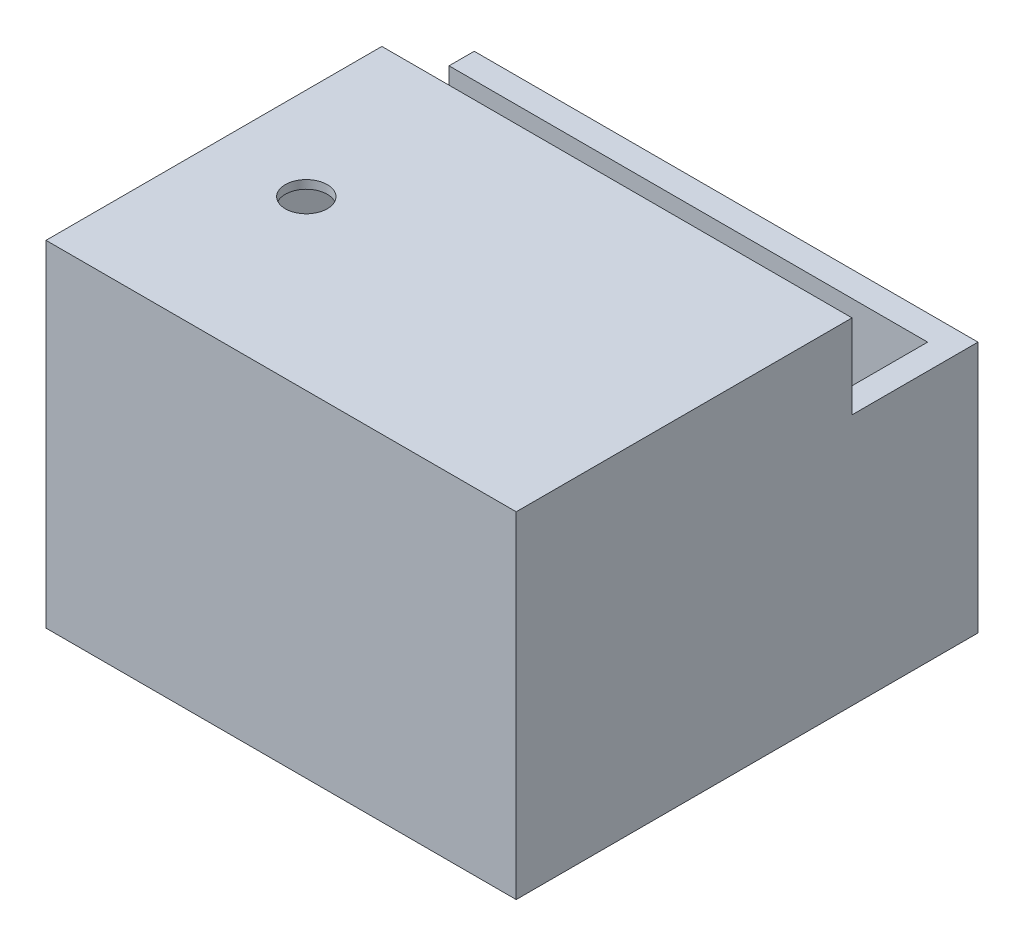
ISO-10303-21;
HEADER;
FILE_DESCRIPTION(('STEP AP214'),'2;1');
FILE_NAME('part.step','',(''),(''),'','','');
FILE_SCHEMA(('AUTOMOTIVE_DESIGN { 1 0 10303 214 1 1 1 1 }'));
ENDSEC;
DATA;
#1=APPLICATION_CONTEXT('core data for automotive mechanical design processes');
#2=APPLICATION_PROTOCOL_DEFINITION('international standard','automotive_design',2000,#1);
#3=PRODUCT_CONTEXT('',#1,'mechanical');
#4=PRODUCT('Part','Part','',(#3));
#5=PRODUCT_RELATED_PRODUCT_CATEGORY('part','',(#4));
#6=PRODUCT_DEFINITION_FORMATION('','',#4);
#7=PRODUCT_DEFINITION_CONTEXT('part definition',#1,'design');
#8=PRODUCT_DEFINITION('design','',#6,#7);
#9=PRODUCT_DEFINITION_SHAPE('','',#8);
#10=(LENGTH_UNIT() NAMED_UNIT(*) SI_UNIT(.MILLI.,.METRE.));
#11=(NAMED_UNIT(*) PLANE_ANGLE_UNIT() SI_UNIT($,.RADIAN.));
#12=(NAMED_UNIT(*) SI_UNIT($,.STERADIAN.) SOLID_ANGLE_UNIT());
#13=UNCERTAINTY_MEASURE_WITH_UNIT(LENGTH_MEASURE(1.E-05),#10,'distance_accuracy_value','');
#14=(GEOMETRIC_REPRESENTATION_CONTEXT(3) GLOBAL_UNCERTAINTY_ASSIGNED_CONTEXT((#13)) GLOBAL_UNIT_ASSIGNED_CONTEXT((#10,
#11,#12)) REPRESENTATION_CONTEXT('',''));
#15=CARTESIAN_POINT('',(0.,0.,0.));
#16=DIRECTION('',(0.,0.,1.));
#17=DIRECTION('',(1.,0.,0.));
#18=AXIS2_PLACEMENT_3D('',#15,#16,#17);
#19=CARTESIAN_POINT('',(4.,0.,0.));
#20=DIRECTION('',(-1.,0.,0.));
#21=DIRECTION('',(0.,0.,1.));
#22=AXIS2_PLACEMENT_3D('',#19,#20,#21);
#23=PLANE('',#22);
#24=DIRECTION('',(0.,1.,0.));
#25=VECTOR('',#24,1.);
#26=CARTESIAN_POINT('',(4.00000000000001,0.,55.));
#27=LINE('',#26,#25);
#28=CARTESIAN_POINT('',(4.00000000000001,0.,55.));
#29=VERTEX_POINT('',#28);
#30=CARTESIAN_POINT('',(4.00000000000001,40.,55.));
#31=VERTEX_POINT('',#30);
#32=EDGE_CURVE('E314',#29,#31,#27,.T.);
#33=ORIENTED_EDGE('',*,*,#32,.T.);
#34=DIRECTION('',(0.,0.,-1.));
#35=VECTOR('',#34,1.);
#36=CARTESIAN_POINT('',(4.00000000000001,40.,55.));
#37=LINE('',#36,#35);
#38=CARTESIAN_POINT('',(4.00000000000001,40.,15.));
#39=VERTEX_POINT('',#38);
#40=EDGE_CURVE('E232',#31,#39,#37,.T.);
#41=ORIENTED_EDGE('',*,*,#40,.T.);
#42=DIRECTION('',(0.,-1.,0.));
#43=VECTOR('',#42,1.);
#44=CARTESIAN_POINT('',(4.00000000000001,40.,15.));
#45=LINE('',#44,#43);
#46=CARTESIAN_POINT('',(4.00000000000001,0.,15.));
#47=VERTEX_POINT('',#46);
#48=EDGE_CURVE('E227',#39,#47,#45,.T.);
#49=ORIENTED_EDGE('',*,*,#48,.T.);
#50=DIRECTION('',(0.,0.,1.));
#51=VECTOR('',#50,1.);
#52=CARTESIAN_POINT('',(4.00000000000001,0.,15.));
#53=LINE('',#52,#51);
#54=EDGE_CURVE('E218',#47,#29,#53,.T.);
#55=ORIENTED_EDGE('',*,*,#54,.T.);
#56=EDGE_LOOP('',(#33,#41,#49,#55));
#57=FACE_BOUND('',#56,.T.);
#58=ADVANCED_FACE('F37',(#57),#23,.T.);
#59=CARTESIAN_POINT('',(14.9999999999998,15.,-7.));
#60=DIRECTION('',(0.,0.,1.));
#61=DIRECTION('',(1.,0.,0.));
#62=AXIS2_PLACEMENT_3D('',#59,#60,#61);
#63=CYLINDRICAL_SURFACE('',#62,4.1);
#64=CARTESIAN_POINT('',(14.9999999999998,15.,0.));
#65=DIRECTION('',(0.,0.,-1.));
#66=DIRECTION('',(-1.,0.,0.));
#67=AXIS2_PLACEMENT_3D('',#64,#65,#66);
#68=CIRCLE('',#67,4.1);
#69=CARTESIAN_POINT('',(10.8999999999998,15.,0.));
#70=VERTEX_POINT('',#69);
#71=EDGE_CURVE('E198',#70,#70,#68,.T.);
#72=ORIENTED_EDGE('',*,*,#71,.T.);
#73=EDGE_LOOP('',(#72));
#74=FACE_BOUND('',#73,.T.);
#75=CARTESIAN_POINT('',(14.9999999999998,15.,3.));
#76=DIRECTION('',(0.,0.,1.));
#77=DIRECTION('',(1.,0.,0.));
#78=AXIS2_PLACEMENT_3D('',#75,#76,#77);
#79=CIRCLE('',#78,4.1);
#80=CARTESIAN_POINT('',(19.0999999999998,15.,3.));
#81=VERTEX_POINT('',#80);
#82=EDGE_CURVE('E194',#81,#81,#79,.T.);
#83=ORIENTED_EDGE('',*,*,#82,.T.);
#84=EDGE_LOOP('',(#83));
#85=FACE_BOUND('',#84,.T.);
#86=ADVANCED_FACE('F357',(#74,#85),#63,.F.);
#87=CARTESIAN_POINT('',(0.,30.,0.));
#88=DIRECTION('',(0.,-1.,0.));
#89=DIRECTION('',(-1.,0.,0.));
#90=AXIS2_PLACEMENT_3D('',#87,#88,#89);
#91=PLANE('',#90);
#92=DIRECTION('',(0.,0.,1.));
#93=VECTOR('',#92,1.);
#94=CARTESIAN_POINT('',(57.,30.,0.));
#95=LINE('',#94,#93);
#96=CARTESIAN_POINT('',(57.,30.,3.));
#97=VERTEX_POINT('',#96);
#98=CARTESIAN_POINT('',(57.,30.,15.));
#99=VERTEX_POINT('',#98);
#100=EDGE_CURVE('E88',#97,#99,#95,.T.);
#101=ORIENTED_EDGE('',*,*,#100,.T.);
#102=DIRECTION('',(-1.,0.,0.));
#103=VECTOR('',#102,1.);
#104=CARTESIAN_POINT('',(60.,30.,15.));
#105=LINE('',#104,#103);
#106=CARTESIAN_POINT('',(60.,30.,15.));
#107=VERTEX_POINT('',#106);
#108=EDGE_CURVE('E145',#107,#99,#105,.T.);
#109=ORIENTED_EDGE('',*,*,#108,.F.);
#110=DIRECTION('',(0.,0.,1.));
#111=VECTOR('',#110,1.);
#112=CARTESIAN_POINT('',(60.,30.,0.));
#113=LINE('',#112,#111);
#114=CARTESIAN_POINT('',(60.,30.,0.));
#115=VERTEX_POINT('',#114);
#116=EDGE_CURVE('E117',#115,#107,#113,.T.);
#117=ORIENTED_EDGE('',*,*,#116,.F.);
#118=DIRECTION('',(1.,0.,0.));
#119=VECTOR('',#118,1.);
#120=CARTESIAN_POINT('',(0.,30.,0.));
#121=LINE('',#120,#119);
#122=CARTESIAN_POINT('',(0.,30.,0.));
#123=VERTEX_POINT('',#122);
#124=EDGE_CURVE('E103',#123,#115,#121,.T.);
#125=ORIENTED_EDGE('',*,*,#124,.F.);
#126=DIRECTION('',(0.,0.,-1.));
#127=VECTOR('',#126,1.);
#128=CARTESIAN_POINT('',(0.,30.,3.));
#129=LINE('',#128,#127);
#130=CARTESIAN_POINT('',(0.,30.,3.));
#131=VERTEX_POINT('',#130);
#132=EDGE_CURVE('E115',#131,#123,#129,.T.);
#133=ORIENTED_EDGE('',*,*,#132,.F.);
#134=DIRECTION('',(1.,0.,0.));
#135=VECTOR('',#134,1.);
#136=CARTESIAN_POINT('',(0.,30.,3.));
#137=LINE('',#136,#135);
#138=EDGE_CURVE('E61',#131,#97,#137,.T.);
#139=ORIENTED_EDGE('',*,*,#138,.T.);
#140=EDGE_LOOP('',(#101,#109,#117,#125,#133,#139));
#141=FACE_BOUND('',#140,.T.);
#142=ADVANCED_FACE('F114',(#141),#91,.F.);
#143=CARTESIAN_POINT('',(60.,30.,0.));
#144=DIRECTION('',(1.,0.,0.));
#145=DIRECTION('',(0.,0.,-1.));
#146=AXIS2_PLACEMENT_3D('',#143,#144,#145);
#147=PLANE('',#146);
#148=DIRECTION('',(0.,0.,1.));
#149=VECTOR('',#148,1.);
#150=CARTESIAN_POINT('',(60.,0.,0.));
#151=LINE('',#150,#149);
#152=CARTESIAN_POINT('',(60.,0.,0.));
#153=VERTEX_POINT('',#152);
#154=CARTESIAN_POINT('',(60.,0.,55.));
#155=VERTEX_POINT('',#154);
#156=EDGE_CURVE('E125',#153,#155,#151,.T.);
#157=ORIENTED_EDGE('',*,*,#156,.F.);
#158=DIRECTION('',(0.,-1.,0.));
#159=VECTOR('',#158,1.);
#160=CARTESIAN_POINT('',(60.,30.,0.));
#161=LINE('',#160,#159);
#162=EDGE_CURVE('E110',#115,#153,#161,.T.);
#163=ORIENTED_EDGE('',*,*,#162,.F.);
#164=ORIENTED_EDGE('',*,*,#116,.T.);
#165=DIRECTION('',(0.,-1.,0.));
#166=VECTOR('',#165,1.);
#167=CARTESIAN_POINT('',(60.,0.,15.));
#168=LINE('',#167,#166);
#169=CARTESIAN_POINT('',(60.,40.,15.));
#170=VERTEX_POINT('',#169);
#171=EDGE_CURVE('E173',#170,#107,#168,.T.);
#172=ORIENTED_EDGE('',*,*,#171,.F.);
#173=DIRECTION('',(0.,0.,-1.));
#174=VECTOR('',#173,1.);
#175=CARTESIAN_POINT('',(60.,40.,15.));
#176=LINE('',#175,#174);
#177=CARTESIAN_POINT('',(60.,40.,55.));
#178=VERTEX_POINT('',#177);
#179=EDGE_CURVE('E298',#178,#170,#176,.T.);
#180=ORIENTED_EDGE('',*,*,#179,.F.);
#181=DIRECTION('',(0.,1.,0.));
#182=VECTOR('',#181,1.);
#183=CARTESIAN_POINT('',(60.,0.,55.));
#184=LINE('',#183,#182);
#185=EDGE_CURVE('E177',#155,#178,#184,.T.);
#186=ORIENTED_EDGE('',*,*,#185,.F.);
#187=EDGE_LOOP('',(#157,#163,#164,#172,#180,#186));
#188=FACE_BOUND('',#187,.T.);
#189=ADVANCED_FACE('F311',(#188),#147,.T.);
#190=CARTESIAN_POINT('',(0.,30.,0.));
#191=DIRECTION('',(0.,0.,-1.));
#192=DIRECTION('',(-1.,0.,0.));
#193=AXIS2_PLACEMENT_3D('',#190,#191,#192);
#194=PLANE('',#193);
#195=ORIENTED_EDGE('',*,*,#71,.F.);
#196=EDGE_LOOP('',(#195));
#197=FACE_BOUND('',#196,.T.);
#198=DIRECTION('',(1.,0.,0.));
#199=VECTOR('',#198,1.);
#200=CARTESIAN_POINT('',(0.,0.,0.));
#201=LINE('',#200,#199);
#202=CARTESIAN_POINT('',(0.,0.,0.));
#203=VERTEX_POINT('',#202);
#204=EDGE_CURVE('E105',#203,#153,#201,.T.);
#205=ORIENTED_EDGE('',*,*,#204,.F.);
#206=DIRECTION('',(0.,-1.,0.));
#207=VECTOR('',#206,1.);
#208=CARTESIAN_POINT('',(0.,30.,0.));
#209=LINE('',#208,#207);
#210=EDGE_CURVE('E100',#123,#203,#209,.T.);
#211=ORIENTED_EDGE('',*,*,#210,.F.);
#212=ORIENTED_EDGE('',*,*,#124,.T.);
#213=ORIENTED_EDGE('',*,*,#162,.T.);
#214=EDGE_LOOP('',(#205,#211,#212,#213));
#215=FACE_BOUND('',#214,.T.);
#216=ADVANCED_FACE('F102',(#197,#215),#194,.T.);
#217=CARTESIAN_POINT('',(0.,30.,3.));
#218=DIRECTION('',(-1.,0.,0.));
#219=DIRECTION('',(0.,0.,1.));
#220=AXIS2_PLACEMENT_3D('',#217,#218,#219);
#221=PLANE('',#220);
#222=DIRECTION('',(0.,0.,-1.));
#223=VECTOR('',#222,1.);
#224=CARTESIAN_POINT('',(0.,0.,3.));
#225=LINE('',#224,#223);
#226=CARTESIAN_POINT('',(0.,0.,3.));
#227=VERTEX_POINT('',#226);
#228=EDGE_CURVE('E130',#227,#203,#225,.T.);
#229=ORIENTED_EDGE('',*,*,#228,.F.);
#230=DIRECTION('',(0.,-1.,0.));
#231=VECTOR('',#230,1.);
#232=CARTESIAN_POINT('',(0.,30.,3.));
#233=LINE('',#232,#231);
#234=EDGE_CURVE('E111',#131,#227,#233,.T.);
#235=ORIENTED_EDGE('',*,*,#234,.F.);
#236=ORIENTED_EDGE('',*,*,#132,.T.);
#237=ORIENTED_EDGE('',*,*,#210,.T.);
#238=EDGE_LOOP('',(#229,#235,#236,#237));
#239=FACE_BOUND('',#238,.T.);
#240=ADVANCED_FACE('F119',(#239),#221,.T.);
#241=CARTESIAN_POINT('',(0.,30.,3.));
#242=DIRECTION('',(0.,0.,-1.));
#243=DIRECTION('',(-1.,0.,0.));
#244=AXIS2_PLACEMENT_3D('',#241,#242,#243);
#245=PLANE('',#244);
#246=ORIENTED_EDGE('',*,*,#82,.F.);
#247=EDGE_LOOP('',(#246));
#248=FACE_BOUND('',#247,.T.);
#249=DIRECTION('',(1.,0.,0.));
#250=VECTOR('',#249,1.);
#251=CARTESIAN_POINT('',(0.,0.,3.));
#252=LINE('',#251,#250);
#253=CARTESIAN_POINT('',(57.,0.,3.));
#254=VERTEX_POINT('',#253);
#255=EDGE_CURVE('E82',#227,#254,#252,.T.);
#256=ORIENTED_EDGE('',*,*,#255,.T.);
#257=DIRECTION('',(0.,-1.,0.));
#258=VECTOR('',#257,1.);
#259=CARTESIAN_POINT('',(57.,30.,3.));
#260=LINE('',#259,#258);
#261=EDGE_CURVE('E121',#97,#254,#260,.T.);
#262=ORIENTED_EDGE('',*,*,#261,.F.);
#263=ORIENTED_EDGE('',*,*,#138,.F.);
#264=ORIENTED_EDGE('',*,*,#234,.T.);
#265=EDGE_LOOP('',(#256,#262,#263,#264));
#266=FACE_BOUND('',#265,.T.);
#267=ADVANCED_FACE('F391',(#248,#266),#245,.F.);
#268=CARTESIAN_POINT('',(57.,30.,0.));
#269=DIRECTION('',(1.,0.,0.));
#270=DIRECTION('',(0.,0.,-1.));
#271=AXIS2_PLACEMENT_3D('',#268,#269,#270);
#272=PLANE('',#271);
#273=DIRECTION('',(0.,0.,1.));
#274=VECTOR('',#273,1.);
#275=CARTESIAN_POINT('',(57.,0.,0.));
#276=LINE('',#275,#274);
#277=CARTESIAN_POINT('',(57.,0.,15.));
#278=VERTEX_POINT('',#277);
#279=EDGE_CURVE('E128',#254,#278,#276,.T.);
#280=ORIENTED_EDGE('',*,*,#279,.T.);
#281=DIRECTION('',(0.,-1.,0.));
#282=VECTOR('',#281,1.);
#283=CARTESIAN_POINT('',(57.,30.,15.));
#284=LINE('',#283,#282);
#285=EDGE_CURVE('E136',#99,#278,#284,.T.);
#286=ORIENTED_EDGE('',*,*,#285,.F.);
#287=ORIENTED_EDGE('',*,*,#100,.F.);
#288=ORIENTED_EDGE('',*,*,#261,.T.);
#289=EDGE_LOOP('',(#280,#286,#287,#288));
#290=FACE_BOUND('',#289,.T.);
#291=ADVANCED_FACE('F205',(#290),#272,.F.);
#292=CARTESIAN_POINT('',(0.,0.,0.));
#293=DIRECTION('',(0.,-1.,0.));
#294=DIRECTION('',(-1.,0.,0.));
#295=AXIS2_PLACEMENT_3D('',#292,#293,#294);
#296=PLANE('',#295);
#297=CARTESIAN_POINT('',(14.9999999999998,0.,35.));
#298=DIRECTION('',(0.,-1.,0.));
#299=DIRECTION('',(0.,0.,-1.));
#300=AXIS2_PLACEMENT_3D('',#297,#298,#299);
#301=CIRCLE('',#300,2.5);
#302=CARTESIAN_POINT('',(14.9999999999998,0.,37.5));
#303=VERTEX_POINT('',#302);
#304=EDGE_CURVE('E318',#303,#303,#301,.T.);
#305=ORIENTED_EDGE('',*,*,#304,.F.);
#306=EDGE_LOOP('',(#305));
#307=FACE_BOUND('',#306,.T.);
#308=ORIENTED_EDGE('',*,*,#279,.F.);
#309=ORIENTED_EDGE('',*,*,#255,.F.);
#310=ORIENTED_EDGE('',*,*,#228,.T.);
#311=ORIENTED_EDGE('',*,*,#204,.T.);
#312=ORIENTED_EDGE('',*,*,#156,.T.);
#313=DIRECTION('',(1.,0.,0.));
#314=VECTOR('',#313,1.);
#315=CARTESIAN_POINT('',(45.,0.,55.));
#316=LINE('',#315,#314);
#317=EDGE_CURVE('E195',#29,#155,#316,.T.);
#318=ORIENTED_EDGE('',*,*,#317,.F.);
#319=ORIENTED_EDGE('',*,*,#54,.F.);
#320=DIRECTION('',(1.,0.,0.));
#321=VECTOR('',#320,1.);
#322=CARTESIAN_POINT('',(45.,0.,15.));
#323=LINE('',#322,#321);
#324=EDGE_CURVE('E191',#47,#278,#323,.T.);
#325=ORIENTED_EDGE('',*,*,#324,.T.);
#326=EDGE_LOOP('',(#308,#309,#310,#311,#312,#318,#319,#325));
#327=FACE_BOUND('',#326,.T.);
#328=ADVANCED_FACE('F215',(#307,#327),#296,.T.);
#329=CARTESIAN_POINT('',(45.,0.,15.));
#330=DIRECTION('',(0.,0.,1.));
#331=DIRECTION('',(1.,0.,0.));
#332=AXIS2_PLACEMENT_3D('',#329,#330,#331);
#333=PLANE('',#332);
#334=ORIENTED_EDGE('',*,*,#171,.T.);
#335=ORIENTED_EDGE('',*,*,#108,.T.);
#336=ORIENTED_EDGE('',*,*,#285,.T.);
#337=ORIENTED_EDGE('',*,*,#324,.F.);
#338=ORIENTED_EDGE('',*,*,#48,.F.);
#339=DIRECTION('',(1.,0.,0.));
#340=VECTOR('',#339,1.);
#341=CARTESIAN_POINT('',(45.,40.,15.));
#342=LINE('',#341,#340);
#343=EDGE_CURVE('E302',#39,#170,#342,.T.);
#344=ORIENTED_EDGE('',*,*,#343,.T.);
#345=EDGE_LOOP('',(#334,#335,#336,#337,#338,#344));
#346=FACE_BOUND('',#345,.T.);
#347=ADVANCED_FACE('F210',(#346),#333,.F.);
#348=CARTESIAN_POINT('',(45.,0.,55.));
#349=DIRECTION('',(0.,0.,-1.));
#350=DIRECTION('',(-1.,0.,0.));
#351=AXIS2_PLACEMENT_3D('',#348,#349,#350);
#352=PLANE('',#351);
#353=ORIENTED_EDGE('',*,*,#185,.T.);
#354=DIRECTION('',(1.,0.,0.));
#355=VECTOR('',#354,1.);
#356=CARTESIAN_POINT('',(45.,40.,55.));
#357=LINE('',#356,#355);
#358=EDGE_CURVE('E305',#31,#178,#357,.T.);
#359=ORIENTED_EDGE('',*,*,#358,.F.);
#360=ORIENTED_EDGE('',*,*,#32,.F.);
#361=ORIENTED_EDGE('',*,*,#317,.T.);
#362=EDGE_LOOP('',(#353,#359,#360,#361));
#363=FACE_BOUND('',#362,.T.);
#364=ADVANCED_FACE('F313',(#363),#352,.F.);
#365=CARTESIAN_POINT('',(45.,40.,15.));
#366=DIRECTION('',(0.,-1.,0.));
#367=DIRECTION('',(0.,0.,-1.));
#368=AXIS2_PLACEMENT_3D('',#365,#366,#367);
#369=PLANE('',#368);
#370=CARTESIAN_POINT('',(14.9999999999998,40.,35.));
#371=DIRECTION('',(0.,1.,0.));
#372=DIRECTION('',(0.,0.,1.));
#373=AXIS2_PLACEMENT_3D('',#370,#371,#372);
#374=CIRCLE('',#373,2.5);
#375=CARTESIAN_POINT('',(14.9999999999998,40.,37.5));
#376=VERTEX_POINT('',#375);
#377=EDGE_CURVE('E326',#376,#376,#374,.T.);
#378=ORIENTED_EDGE('',*,*,#377,.F.);
#379=EDGE_LOOP('',(#378));
#380=FACE_BOUND('',#379,.T.);
#381=ORIENTED_EDGE('',*,*,#179,.T.);
#382=ORIENTED_EDGE('',*,*,#343,.F.);
#383=ORIENTED_EDGE('',*,*,#40,.F.);
#384=ORIENTED_EDGE('',*,*,#358,.T.);
#385=EDGE_LOOP('',(#381,#382,#383,#384));
#386=FACE_BOUND('',#385,.T.);
#387=ADVANCED_FACE('F300',(#380,#386),#369,.F.);
#388=CARTESIAN_POINT('',(14.9999999999998,-5.00000000014378E-05,35.));
#389=DIRECTION('',(0.,1.,0.));
#390=DIRECTION('',(0.,0.,1.));
#391=AXIS2_PLACEMENT_3D('',#388,#389,#390);
#392=CYLINDRICAL_SURFACE('',#391,2.5);
#393=CARTESIAN_POINT('',(14.9999999999998,1.,35.));
#394=DIRECTION('',(0.,-1.,0.));
#395=DIRECTION('',(0.,0.,-1.));
#396=AXIS2_PLACEMENT_3D('',#393,#394,#395);
#397=CIRCLE('',#396,2.5);
#398=CARTESIAN_POINT('',(14.9999999999998,1.,37.5));
#399=VERTEX_POINT('',#398);
#400=EDGE_CURVE('E335',#399,#399,#397,.T.);
#401=CARTESIAN_POINT('',(14.9999999999998,0.,37.5));
#402=CARTESIAN_POINT('',(14.9999999999998,0.0104166666666667,37.5));
#403=CARTESIAN_POINT('',(14.9999999999998,0.0208333333333333,37.5));
#404=CARTESIAN_POINT('',(14.9999999999998,0.0416666666666667,37.5));
#405=CARTESIAN_POINT('',(14.9999999999998,0.0520833333333333,37.5));
#406=CARTESIAN_POINT('',(14.9999999999998,0.0729166666666667,37.5));
#407=CARTESIAN_POINT('',(14.9999999999998,0.0833333333333333,37.5));
#408=CARTESIAN_POINT('',(14.9999999999998,0.104166666666667,37.5));
#409=CARTESIAN_POINT('',(14.9999999999998,0.114583333333333,37.5));
#410=CARTESIAN_POINT('',(14.9999999999998,0.135416666666667,37.5));
#411=CARTESIAN_POINT('',(14.9999999999998,0.145833333333333,37.5));
#412=CARTESIAN_POINT('',(14.9999999999998,0.166666666666667,37.5));
#413=CARTESIAN_POINT('',(14.9999999999998,0.177083333333333,37.5));
#414=CARTESIAN_POINT('',(14.9999999999998,0.197916666666667,37.5));
#415=CARTESIAN_POINT('',(14.9999999999998,0.208333333333333,37.5));
#416=CARTESIAN_POINT('',(14.9999999999998,0.229166666666667,37.5));
#417=CARTESIAN_POINT('',(14.9999999999998,0.239583333333333,37.5));
#418=CARTESIAN_POINT('',(14.9999999999998,0.260416666666667,37.5));
#419=CARTESIAN_POINT('',(14.9999999999998,0.270833333333333,37.5));
#420=CARTESIAN_POINT('',(14.9999999999998,0.291666666666667,37.5));
#421=CARTESIAN_POINT('',(14.9999999999998,0.302083333333333,37.5));
#422=CARTESIAN_POINT('',(14.9999999999998,0.322916666666667,37.5));
#423=CARTESIAN_POINT('',(14.9999999999998,0.333333333333333,37.5));
#424=CARTESIAN_POINT('',(14.9999999999998,0.354166666666667,37.5));
#425=CARTESIAN_POINT('',(14.9999999999998,0.364583333333333,37.5));
#426=CARTESIAN_POINT('',(14.9999999999998,0.385416666666667,37.5));
#427=CARTESIAN_POINT('',(14.9999999999998,0.395833333333333,37.5));
#428=CARTESIAN_POINT('',(14.9999999999998,0.416666666666667,37.5));
#429=CARTESIAN_POINT('',(14.9999999999998,0.427083333333333,37.5));
#430=CARTESIAN_POINT('',(14.9999999999998,0.447916666666667,37.5));
#431=CARTESIAN_POINT('',(14.9999999999998,0.458333333333333,37.5));
#432=CARTESIAN_POINT('',(14.9999999999998,0.479166666666667,37.5));
#433=CARTESIAN_POINT('',(14.9999999999998,0.489583333333333,37.5));
#434=CARTESIAN_POINT('',(14.9999999999998,0.510416666666667,37.5));
#435=CARTESIAN_POINT('',(14.9999999999998,0.520833333333333,37.5));
#436=CARTESIAN_POINT('',(14.9999999999998,0.541666666666667,37.5));
#437=CARTESIAN_POINT('',(14.9999999999998,0.552083333333333,37.5));
#438=CARTESIAN_POINT('',(14.9999999999998,0.572916666666667,37.5));
#439=CARTESIAN_POINT('',(14.9999999999998,0.583333333333333,37.5));
#440=CARTESIAN_POINT('',(14.9999999999998,0.604166666666667,37.5));
#441=CARTESIAN_POINT('',(14.9999999999998,0.614583333333333,37.5));
#442=CARTESIAN_POINT('',(14.9999999999998,0.635416666666667,37.5));
#443=CARTESIAN_POINT('',(14.9999999999998,0.645833333333333,37.5));
#444=CARTESIAN_POINT('',(14.9999999999998,0.666666666666667,37.5));
#445=CARTESIAN_POINT('',(14.9999999999998,0.677083333333333,37.5));
#446=CARTESIAN_POINT('',(14.9999999999998,0.697916666666667,37.5));
#447=CARTESIAN_POINT('',(14.9999999999998,0.708333333333333,37.5));
#448=CARTESIAN_POINT('',(14.9999999999998,0.729166666666667,37.5));
#449=CARTESIAN_POINT('',(14.9999999999998,0.739583333333333,37.5));
#450=CARTESIAN_POINT('',(14.9999999999998,0.760416666666667,37.5));
#451=CARTESIAN_POINT('',(14.9999999999998,0.770833333333333,37.5));
#452=CARTESIAN_POINT('',(14.9999999999998,0.791666666666667,37.5));
#453=CARTESIAN_POINT('',(14.9999999999998,0.802083333333333,37.5));
#454=CARTESIAN_POINT('',(14.9999999999998,0.822916666666667,37.5));
#455=CARTESIAN_POINT('',(14.9999999999998,0.833333333333333,37.5));
#456=CARTESIAN_POINT('',(14.9999999999998,0.854166666666667,37.5));
#457=CARTESIAN_POINT('',(14.9999999999998,0.864583333333333,37.5));
#458=CARTESIAN_POINT('',(14.9999999999998,0.885416666666667,37.5));
#459=CARTESIAN_POINT('',(14.9999999999998,0.895833333333333,37.5));
#460=CARTESIAN_POINT('',(14.9999999999998,0.916666666666667,37.5));
#461=CARTESIAN_POINT('',(14.9999999999998,0.927083333333333,37.5));
#462=CARTESIAN_POINT('',(14.9999999999998,0.947916666666667,37.5));
#463=CARTESIAN_POINT('',(14.9999999999998,0.958333333333333,37.5));
#464=CARTESIAN_POINT('',(14.9999999999998,0.979166666666667,37.5));
#465=CARTESIAN_POINT('',(14.9999999999998,0.989583333333333,37.5));
#466=CARTESIAN_POINT('',(14.9999999999998,1.,37.5));
#467=B_SPLINE_CURVE_WITH_KNOTS('',3,(#401,#402,#403,#404,#405,#406,#407,#408,#409,#410,#411,
#412,#413,#414,#415,#416,#417,#418,#419,#420,#421,#422,#423,#424,#425,#426,#427,#428,#429,#430,
#431,#432,#433,#434,#435,#436,#437,#438,#439,#440,#441,#442,#443,#444,#445,#446,#447,#448,#449,
#450,#451,#452,#453,#454,#455,#456,#457,#458,#459,#460,#461,#462,#463,#464,#465,#466),
.UNSPECIFIED.,.F.,.F.,(4,2,2,2,2,2,2,2,2,2,2,2,2,2,2,2,2,2,2,2,2,2,2,2,2,2,2,2,2,2,2,2,4),(0.,
0.03125,0.0625,0.09375,0.125,0.15625,0.1875,0.21875,0.25,0.28125,0.3125,0.34375,0.375,0.40625,
0.4375,0.46875,0.5,0.53125,0.5625,0.59375,0.625,0.65625,0.6875,0.71875,0.75,0.78125,0.8125,
0.84375,0.875,0.90625,0.9375,0.96875,1.),.UNSPECIFIED.);
#468=EDGE_CURVE('BSEAM342',#303,#399,#467,.T.);
#469=ORIENTED_EDGE('',*,*,#304,.T.);
#470=ORIENTED_EDGE('',*,*,#400,.F.);
#471=ORIENTED_EDGE('',*,*,#468,.T.);
#472=ORIENTED_EDGE('',*,*,#468,.F.);
#473=EDGE_LOOP('',(#469,#471,#470,#472));
#474=FACE_BOUND('',#473,.T.);
#475=ADVANCED_FACE('F342',(#474),#392,.F.);
#476=CARTESIAN_POINT('',(14.9999999999998,39.,35.));
#477=DIRECTION('',(0.,-1.,0.));
#478=DIRECTION('',(0.,0.,-1.));
#479=AXIS2_PLACEMENT_3D('',#476,#477,#478);
#480=CIRCLE('',#479,2.5);
#481=CARTESIAN_POINT('',(14.9999999999998,39.,37.5));
#482=VERTEX_POINT('',#481);
#483=EDGE_CURVE('E321',#482,#482,#480,.T.);
#484=CARTESIAN_POINT('',(14.9999999999998,39.,37.5));
#485=CARTESIAN_POINT('',(14.9999999999998,39.0104166666667,37.5));
#486=CARTESIAN_POINT('',(14.9999999999998,39.0208333333333,37.5));
#487=CARTESIAN_POINT('',(14.9999999999998,39.0416666666667,37.5));
#488=CARTESIAN_POINT('',(14.9999999999998,39.0520833333333,37.5));
#489=CARTESIAN_POINT('',(14.9999999999998,39.0729166666667,37.5));
#490=CARTESIAN_POINT('',(14.9999999999998,39.0833333333333,37.5));
#491=CARTESIAN_POINT('',(14.9999999999998,39.1041666666667,37.5));
#492=CARTESIAN_POINT('',(14.9999999999998,39.1145833333333,37.5));
#493=CARTESIAN_POINT('',(14.9999999999998,39.1354166666667,37.5));
#494=CARTESIAN_POINT('',(14.9999999999998,39.1458333333333,37.5));
#495=CARTESIAN_POINT('',(14.9999999999998,39.1666666666667,37.5));
#496=CARTESIAN_POINT('',(14.9999999999998,39.1770833333333,37.5));
#497=CARTESIAN_POINT('',(14.9999999999998,39.1979166666667,37.5));
#498=CARTESIAN_POINT('',(14.9999999999998,39.2083333333333,37.5));
#499=CARTESIAN_POINT('',(14.9999999999998,39.2291666666667,37.5));
#500=CARTESIAN_POINT('',(14.9999999999998,39.2395833333333,37.5));
#501=CARTESIAN_POINT('',(14.9999999999998,39.2604166666667,37.5));
#502=CARTESIAN_POINT('',(14.9999999999998,39.2708333333333,37.5));
#503=CARTESIAN_POINT('',(14.9999999999998,39.2916666666667,37.5));
#504=CARTESIAN_POINT('',(14.9999999999998,39.3020833333333,37.5));
#505=CARTESIAN_POINT('',(14.9999999999998,39.3229166666667,37.5));
#506=CARTESIAN_POINT('',(14.9999999999998,39.3333333333333,37.5));
#507=CARTESIAN_POINT('',(14.9999999999998,39.3541666666667,37.5));
#508=CARTESIAN_POINT('',(14.9999999999998,39.3645833333333,37.5));
#509=CARTESIAN_POINT('',(14.9999999999998,39.3854166666667,37.5));
#510=CARTESIAN_POINT('',(14.9999999999998,39.3958333333333,37.5));
#511=CARTESIAN_POINT('',(14.9999999999998,39.4166666666667,37.5));
#512=CARTESIAN_POINT('',(14.9999999999998,39.4270833333333,37.5));
#513=CARTESIAN_POINT('',(14.9999999999998,39.4479166666667,37.5));
#514=CARTESIAN_POINT('',(14.9999999999998,39.4583333333333,37.5));
#515=CARTESIAN_POINT('',(14.9999999999998,39.4791666666667,37.5));
#516=CARTESIAN_POINT('',(14.9999999999998,39.4895833333333,37.5));
#517=CARTESIAN_POINT('',(14.9999999999998,39.5104166666667,37.5));
#518=CARTESIAN_POINT('',(14.9999999999998,39.5208333333333,37.5));
#519=CARTESIAN_POINT('',(14.9999999999998,39.5416666666667,37.5));
#520=CARTESIAN_POINT('',(14.9999999999998,39.5520833333333,37.5));
#521=CARTESIAN_POINT('',(14.9999999999998,39.5729166666667,37.5));
#522=CARTESIAN_POINT('',(14.9999999999998,39.5833333333333,37.5));
#523=CARTESIAN_POINT('',(14.9999999999998,39.6041666666667,37.5));
#524=CARTESIAN_POINT('',(14.9999999999998,39.6145833333333,37.5));
#525=CARTESIAN_POINT('',(14.9999999999998,39.6354166666667,37.5));
#526=CARTESIAN_POINT('',(14.9999999999998,39.6458333333333,37.5));
#527=CARTESIAN_POINT('',(14.9999999999998,39.6666666666667,37.5));
#528=CARTESIAN_POINT('',(14.9999999999998,39.6770833333333,37.5));
#529=CARTESIAN_POINT('',(14.9999999999998,39.6979166666667,37.5));
#530=CARTESIAN_POINT('',(14.9999999999998,39.7083333333333,37.5));
#531=CARTESIAN_POINT('',(14.9999999999998,39.7291666666667,37.5));
#532=CARTESIAN_POINT('',(14.9999999999998,39.7395833333333,37.5));
#533=CARTESIAN_POINT('',(14.9999999999998,39.7604166666667,37.5));
#534=CARTESIAN_POINT('',(14.9999999999998,39.7708333333333,37.5));
#535=CARTESIAN_POINT('',(14.9999999999998,39.7916666666667,37.5));
#536=CARTESIAN_POINT('',(14.9999999999998,39.8020833333333,37.5));
#537=CARTESIAN_POINT('',(14.9999999999998,39.8229166666667,37.5));
#538=CARTESIAN_POINT('',(14.9999999999998,39.8333333333333,37.5));
#539=CARTESIAN_POINT('',(14.9999999999998,39.8541666666667,37.5));
#540=CARTESIAN_POINT('',(14.9999999999998,39.8645833333333,37.5));
#541=CARTESIAN_POINT('',(14.9999999999998,39.8854166666667,37.5));
#542=CARTESIAN_POINT('',(14.9999999999998,39.8958333333333,37.5));
#543=CARTESIAN_POINT('',(14.9999999999998,39.9166666666667,37.5));
#544=CARTESIAN_POINT('',(14.9999999999998,39.9270833333333,37.5));
#545=CARTESIAN_POINT('',(14.9999999999998,39.9479166666667,37.5));
#546=CARTESIAN_POINT('',(14.9999999999998,39.9583333333333,37.5));
#547=CARTESIAN_POINT('',(14.9999999999998,39.9791666666667,37.5));
#548=CARTESIAN_POINT('',(14.9999999999998,39.9895833333333,37.5));
#549=CARTESIAN_POINT('',(14.9999999999998,40.,37.5));
#550=B_SPLINE_CURVE_WITH_KNOTS('',3,(#484,#485,#486,#487,#488,#489,#490,#491,#492,#493,#494,
#495,#496,#497,#498,#499,#500,#501,#502,#503,#504,#505,#506,#507,#508,#509,#510,#511,#512,#513,
#514,#515,#516,#517,#518,#519,#520,#521,#522,#523,#524,#525,#526,#527,#528,#529,#530,#531,#532,
#533,#534,#535,#536,#537,#538,#539,#540,#541,#542,#543,#544,#545,#546,#547,#548,#549),
.UNSPECIFIED.,.F.,.F.,(4,2,2,2,2,2,2,2,2,2,2,2,2,2,2,2,2,2,2,2,2,2,2,2,2,2,2,2,2,2,2,2,4),(0.,
0.0312499999999966,0.0625000000000001,0.0937500000000036,0.125,0.156249999999997,0.1875,
0.218750000000004,0.25,0.281249999999997,0.3125,0.343750000000004,0.375,0.406249999999997,
0.4375,0.468750000000004,0.5,0.531249999999997,0.5625,0.593750000000004,0.625000000000001,
0.656249999999997,0.687500000000001,0.718750000000004,0.750000000000001,0.781249999999997,
0.812500000000001,0.843750000000004,0.875000000000001,0.906249999999997,0.937500000000001,
0.968750000000004,1.),.UNSPECIFIED.);
#551=EDGE_CURVE('BSEAM344',#482,#376,#550,.T.);
#552=ORIENTED_EDGE('',*,*,#483,.T.);
#553=ORIENTED_EDGE('',*,*,#377,.T.);
#554=ORIENTED_EDGE('',*,*,#551,.T.);
#555=ORIENTED_EDGE('',*,*,#551,.F.);
#556=EDGE_LOOP('',(#552,#554,#553,#555));
#557=FACE_BOUND('',#556,.T.);
#558=ADVANCED_FACE('F344',(#557),#392,.F.);
#559=CARTESIAN_POINT('',(45.,0.,0.));
#560=DIRECTION('',(1.,0.,0.));
#561=DIRECTION('',(0.,0.,-1.));
#562=AXIS2_PLACEMENT_3D('',#559,#560,#561);
#563=PLANE('',#562);
#564=DIRECTION('',(0.,1.,0.));
#565=VECTOR('',#564,1.);
#566=CARTESIAN_POINT('',(45.,1.,54.));
#567=LINE('',#566,#565);
#568=CARTESIAN_POINT('',(45.,1.,54.));
#569=VERTEX_POINT('',#568);
#570=CARTESIAN_POINT('',(45.,39.,54.));
#571=VERTEX_POINT('',#570);
#572=EDGE_CURVE('E240',#569,#571,#567,.T.);
#573=ORIENTED_EDGE('',*,*,#572,.T.);
#574=DIRECTION('',(0.,0.,-1.));
#575=VECTOR('',#574,1.);
#576=CARTESIAN_POINT('',(45.,39.,54.));
#577=LINE('',#576,#575);
#578=CARTESIAN_POINT('',(45.,39.,16.));
#579=VERTEX_POINT('',#578);
#580=EDGE_CURVE('E226',#571,#579,#577,.T.);
#581=ORIENTED_EDGE('',*,*,#580,.T.);
#582=DIRECTION('',(0.,-1.,0.));
#583=VECTOR('',#582,1.);
#584=CARTESIAN_POINT('',(45.,39.,16.));
#585=LINE('',#584,#583);
#586=CARTESIAN_POINT('',(45.,1.,16.));
#587=VERTEX_POINT('',#586);
#588=EDGE_CURVE('E230',#579,#587,#585,.T.);
#589=ORIENTED_EDGE('',*,*,#588,.T.);
#590=DIRECTION('',(0.,0.,1.));
#591=VECTOR('',#590,1.);
#592=CARTESIAN_POINT('',(45.,1.,16.));
#593=LINE('',#592,#591);
#594=EDGE_CURVE('E250',#587,#569,#593,.T.);
#595=ORIENTED_EDGE('',*,*,#594,.T.);
#596=EDGE_LOOP('',(#573,#581,#589,#595));
#597=FACE_BOUND('',#596,.T.);
#598=CARTESIAN_POINT('',(45.,20.,35.));
#599=DIRECTION('',(1.,0.,0.));
#600=DIRECTION('',(0.,0.,-1.));
#601=AXIS2_PLACEMENT_3D('',#598,#599,#600);
#602=CIRCLE('',#601,8.);
#603=CARTESIAN_POINT('',(45.,20.,27.));
#604=VERTEX_POINT('',#603);
#605=EDGE_CURVE('E45',#604,#604,#602,.T.);
#606=ORIENTED_EDGE('',*,*,#605,.T.);
#607=EDGE_LOOP('',(#606));
#608=FACE_BOUND('',#607,.T.);
#609=ADVANCED_FACE('F157',(#597,#608),#563,.F.);
#610=CARTESIAN_POINT('',(40.,20.,35.));
#611=DIRECTION('',(1.,0.,0.));
#612=DIRECTION('',(0.,0.,-1.));
#613=AXIS2_PLACEMENT_3D('',#610,#611,#612);
#614=CYLINDRICAL_SURFACE('',#613,6.);
#615=CARTESIAN_POINT('',(43.,20.,35.));
#616=DIRECTION('',(1.,0.,0.));
#617=DIRECTION('',(0.,0.,-1.));
#618=AXIS2_PLACEMENT_3D('',#615,#616,#617);
#619=CIRCLE('',#618,6.);
#620=CARTESIAN_POINT('',(43.,20.,29.));
#621=VERTEX_POINT('',#620);
#622=EDGE_CURVE('E143',#621,#621,#619,.F.);
#623=ORIENTED_EDGE('',*,*,#622,.T.);
#624=EDGE_LOOP('',(#623));
#625=FACE_BOUND('',#624,.T.);
#626=CARTESIAN_POINT('',(40.,20.,35.));
#627=DIRECTION('',(-1.,0.,0.));
#628=DIRECTION('',(0.,0.,1.));
#629=AXIS2_PLACEMENT_3D('',#626,#627,#628);
#630=CIRCLE('',#629,6.);
#631=CARTESIAN_POINT('',(40.,20.,41.));
#632=VERTEX_POINT('',#631);
#633=EDGE_CURVE('E171',#632,#632,#630,.T.);
#634=ORIENTED_EDGE('',*,*,#633,.F.);
#635=EDGE_LOOP('',(#634));
#636=FACE_BOUND('',#635,.T.);
#637=ADVANCED_FACE('F165',(#625,#636),#614,.T.);
#638=CARTESIAN_POINT('',(40.,20.,35.));
#639=DIRECTION('',(-1.,0.,0.));
#640=DIRECTION('',(0.,0.,1.));
#641=AXIS2_PLACEMENT_3D('',#638,#639,#640);
#642=PLANE('',#641);
#643=ORIENTED_EDGE('',*,*,#633,.T.);
#644=EDGE_LOOP('',(#643));
#645=FACE_BOUND('',#644,.T.);
#646=ADVANCED_FACE('F162',(#645),#642,.T.);
#647=CARTESIAN_POINT('',(43.,20.,35.));
#648=DIRECTION('',(1.,0.,0.));
#649=DIRECTION('',(0.,0.,-1.));
#650=AXIS2_PLACEMENT_3D('',#647,#648,#649);
#651=TOROIDAL_SURFACE('',#650,8.,2.);
#652=ORIENTED_EDGE('',*,*,#605,.F.);
#653=EDGE_LOOP('',(#652));
#654=FACE_BOUND('',#653,.T.);
#655=ORIENTED_EDGE('',*,*,#622,.F.);
#656=EDGE_LOOP('',(#655));
#657=FACE_BOUND('',#656,.T.);
#658=ADVANCED_FACE('F39',(#654,#657),#651,.F.);
#659=CARTESIAN_POINT('',(5.00000000000001,39.,54.));
#660=DIRECTION('',(0.,-1.,0.));
#661=DIRECTION('',(0.,0.,-1.));
#662=AXIS2_PLACEMENT_3D('',#659,#660,#661);
#663=PLANE('',#662);
#664=ORIENTED_EDGE('',*,*,#483,.F.);
#665=EDGE_LOOP('',(#664));
#666=FACE_BOUND('',#665,.T.);
#667=ORIENTED_EDGE('',*,*,#580,.F.);
#668=DIRECTION('',(1.,0.,0.));
#669=VECTOR('',#668,1.);
#670=CARTESIAN_POINT('',(5.00000000000001,39.,54.));
#671=LINE('',#670,#669);
#672=CARTESIAN_POINT('',(5.00000000000001,39.,54.));
#673=VERTEX_POINT('',#672);
#674=EDGE_CURVE('E52',#673,#571,#671,.T.);
#675=ORIENTED_EDGE('',*,*,#674,.F.);
#676=DIRECTION('',(0.,0.,-1.));
#677=VECTOR('',#676,1.);
#678=CARTESIAN_POINT('',(5.00000000000001,39.,54.));
#679=LINE('',#678,#677);
#680=CARTESIAN_POINT('',(5.00000000000001,39.,16.));
#681=VERTEX_POINT('',#680);
#682=EDGE_CURVE('E236',#673,#681,#679,.T.);
#683=ORIENTED_EDGE('',*,*,#682,.T.);
#684=DIRECTION('',(1.,0.,0.));
#685=VECTOR('',#684,1.);
#686=CARTESIAN_POINT('',(5.,39.,16.));
#687=LINE('',#686,#685);
#688=EDGE_CURVE('E174',#681,#579,#687,.T.);
#689=ORIENTED_EDGE('',*,*,#688,.T.);
#690=EDGE_LOOP('',(#667,#675,#683,#689));
#691=FACE_BOUND('',#690,.T.);
#692=ADVANCED_FACE('F161',(#666,#691),#663,.T.);
#693=CARTESIAN_POINT('',(5.,39.,16.));
#694=DIRECTION('',(0.,0.,1.));
#695=DIRECTION('',(1.,0.,0.));
#696=AXIS2_PLACEMENT_3D('',#693,#694,#695);
#697=PLANE('',#696);
#698=ORIENTED_EDGE('',*,*,#588,.F.);
#699=ORIENTED_EDGE('',*,*,#688,.F.);
#700=DIRECTION('',(0.,-1.,0.));
#701=VECTOR('',#700,1.);
#702=CARTESIAN_POINT('',(5.,39.,16.));
#703=LINE('',#702,#701);
#704=CARTESIAN_POINT('',(5.00000000000001,1.,16.));
#705=VERTEX_POINT('',#704);
#706=EDGE_CURVE('E239',#681,#705,#703,.T.);
#707=ORIENTED_EDGE('',*,*,#706,.T.);
#708=DIRECTION('',(1.,0.,0.));
#709=VECTOR('',#708,1.);
#710=CARTESIAN_POINT('',(5.,1.,16.));
#711=LINE('',#710,#709);
#712=EDGE_CURVE('E180',#705,#587,#711,.T.);
#713=ORIENTED_EDGE('',*,*,#712,.T.);
#714=EDGE_LOOP('',(#698,#699,#707,#713));
#715=FACE_BOUND('',#714,.T.);
#716=ADVANCED_FACE('F264',(#715),#697,.T.);
#717=CARTESIAN_POINT('',(5.,1.,16.));
#718=DIRECTION('',(0.,1.,0.));
#719=DIRECTION('',(0.,0.,1.));
#720=AXIS2_PLACEMENT_3D('',#717,#718,#719);
#721=PLANE('',#720);
#722=CARTESIAN_POINT('',(14.9999999999998,1.,35.));
#723=DIRECTION('',(0.,1.,0.));
#724=DIRECTION('',(0.,0.,1.));
#725=AXIS2_PLACEMENT_3D('',#722,#723,#724);
#726=CIRCLE('',#725,8.96674100075932);
#727=CARTESIAN_POINT('',(14.9999999999998,1.,43.9667410007593));
#728=VERTEX_POINT('',#727);
#729=EDGE_CURVE('E11',#728,#728,#726,.T.);
#730=ORIENTED_EDGE('',*,*,#729,.F.);
#731=EDGE_LOOP('',(#730));
#732=FACE_BOUND('',#731,.T.);
#733=ORIENTED_EDGE('',*,*,#594,.F.);
#734=ORIENTED_EDGE('',*,*,#712,.F.);
#735=DIRECTION('',(0.,0.,1.));
#736=VECTOR('',#735,1.);
#737=CARTESIAN_POINT('',(5.,1.,16.));
#738=LINE('',#737,#736);
#739=CARTESIAN_POINT('',(5.00000000000001,1.,54.));
#740=VERTEX_POINT('',#739);
#741=EDGE_CURVE('E243',#705,#740,#738,.T.);
#742=ORIENTED_EDGE('',*,*,#741,.T.);
#743=DIRECTION('',(1.,0.,0.));
#744=VECTOR('',#743,1.);
#745=CARTESIAN_POINT('',(5.00000000000001,1.,54.));
#746=LINE('',#745,#744);
#747=EDGE_CURVE('E256',#740,#569,#746,.T.);
#748=ORIENTED_EDGE('',*,*,#747,.T.);
#749=EDGE_LOOP('',(#733,#734,#742,#748));
#750=FACE_BOUND('',#749,.T.);
#751=ADVANCED_FACE('F272',(#732,#750),#721,.T.);
#752=CARTESIAN_POINT('',(5.00000000000001,1.,54.));
#753=DIRECTION('',(0.,0.,-1.));
#754=DIRECTION('',(-1.,0.,0.));
#755=AXIS2_PLACEMENT_3D('',#752,#753,#754);
#756=PLANE('',#755);
#757=ORIENTED_EDGE('',*,*,#572,.F.);
#758=ORIENTED_EDGE('',*,*,#747,.F.);
#759=DIRECTION('',(0.,1.,0.));
#760=VECTOR('',#759,1.);
#761=CARTESIAN_POINT('',(5.00000000000001,1.,54.));
#762=LINE('',#761,#760);
#763=EDGE_CURVE('E246',#740,#673,#762,.T.);
#764=ORIENTED_EDGE('',*,*,#763,.T.);
#765=ORIENTED_EDGE('',*,*,#674,.T.);
#766=EDGE_LOOP('',(#757,#758,#764,#765));
#767=FACE_BOUND('',#766,.T.);
#768=ADVANCED_FACE('F367',(#767),#756,.T.);
#769=CARTESIAN_POINT('',(5.,0.,0.));
#770=DIRECTION('',(-1.,0.,0.));
#771=DIRECTION('',(0.,0.,1.));
#772=AXIS2_PLACEMENT_3D('',#769,#770,#771);
#773=PLANE('',#772);
#774=ORIENTED_EDGE('',*,*,#682,.F.);
#775=ORIENTED_EDGE('',*,*,#763,.F.);
#776=ORIENTED_EDGE('',*,*,#741,.F.);
#777=ORIENTED_EDGE('',*,*,#706,.F.);
#778=EDGE_LOOP('',(#774,#775,#776,#777));
#779=FACE_BOUND('',#778,.T.);
#780=ADVANCED_FACE('F363',(#779),#773,.F.);
#781=CARTESIAN_POINT('',(14.9999999999998,1.,35.));
#782=DIRECTION('',(0.,-1.,0.));
#783=DIRECTION('',(0.,0.,-1.));
#784=AXIS2_PLACEMENT_3D('',#781,#782,#783);
#785=CYLINDRICAL_SURFACE('',#784,8.96674100075932);
#786=CARTESIAN_POINT('',(14.9999999999998,8.14945752002325,35.));
#787=DIRECTION('',(0.,-1.,0.));
#788=DIRECTION('',(0.,0.,-1.));
#789=AXIS2_PLACEMENT_3D('',#786,#787,#788);
#790=CIRCLE('',#789,8.96674100075932);
#791=CARTESIAN_POINT('',(14.9999999999998,8.14945752002325,26.0332589992407));
#792=VERTEX_POINT('',#791);
#793=EDGE_CURVE('E329',#792,#792,#790,.T.);
#794=ORIENTED_EDGE('',*,*,#793,.T.);
#795=EDGE_LOOP('',(#794));
#796=FACE_BOUND('',#795,.T.);
#797=ORIENTED_EDGE('',*,*,#729,.T.);
#798=EDGE_LOOP('',(#797));
#799=FACE_BOUND('',#798,.T.);
#800=ADVANCED_FACE('F366',(#796,#799),#785,.T.);
#801=CARTESIAN_POINT('',(22.9667410007592,8.14945752002325,35.));
#802=DIRECTION('',(0.,1.,0.));
#803=DIRECTION('',(0.,0.,1.));
#804=AXIS2_PLACEMENT_3D('',#801,#802,#803);
#805=PLANE('',#804);
#806=CARTESIAN_POINT('',(14.9999999999998,8.14945752002325,35.));
#807=DIRECTION('',(0.,-1.,0.));
#808=DIRECTION('',(0.,0.,-1.));
#809=AXIS2_PLACEMENT_3D('',#806,#807,#808);
#810=CIRCLE('',#809,7.96674100075932);
#811=CARTESIAN_POINT('',(14.9999999999998,8.14945752002325,42.9667410007593));
#812=VERTEX_POINT('',#811);
#813=EDGE_CURVE('E332',#812,#812,#810,.T.);
#814=ORIENTED_EDGE('',*,*,#813,.T.);
#815=EDGE_LOOP('',(#814));
#816=FACE_BOUND('',#815,.T.);
#817=ORIENTED_EDGE('',*,*,#793,.F.);
#818=EDGE_LOOP('',(#817));
#819=FACE_BOUND('',#818,.T.);
#820=ADVANCED_FACE('F460',(#816,#819),#805,.T.);
#821=CARTESIAN_POINT('',(14.9999999999998,8.14945752002325,35.));
#822=DIRECTION('',(0.,1.,0.));
#823=DIRECTION('',(0.,0.,1.));
#824=AXIS2_PLACEMENT_3D('',#821,#822,#823);
#825=CONICAL_SURFACE('',#824,7.96674100075932,0.652803275011849);
#826=CARTESIAN_POINT('',(14.9999999999998,0.999999999999999,37.5));
#827=CARTESIAN_POINT('',(14.9999999999998,1.07447351583358,37.5569452187579));
#828=CARTESIAN_POINT('',(14.9999999999998,1.14894703166715,37.6138904375158));
#829=CARTESIAN_POINT('',(14.9999999999998,1.2978940633343,37.7277808750316));
#830=CARTESIAN_POINT('',(14.9999999999998,1.37236757916788,37.7847260937895));
#831=CARTESIAN_POINT('',(14.9999999999998,1.52131461083503,37.8986165313054));
#832=CARTESIAN_POINT('',(14.9999999999998,1.5957881266686,37.9555617500633));
#833=CARTESIAN_POINT('',(14.9999999999998,1.74473515833575,38.0694521875791));
#834=CARTESIAN_POINT('',(14.9999999999998,1.81920867416933,38.126397406337));
#835=CARTESIAN_POINT('',(14.9999999999998,1.96815570583648,38.2402878438528));
#836=CARTESIAN_POINT('',(14.9999999999998,2.04262922167006,38.2972330626107));
#837=CARTESIAN_POINT('',(14.9999999999998,2.19157625333721,38.4111235001265));
#838=CARTESIAN_POINT('',(14.9999999999998,2.26604976917078,38.4680687188845));
#839=CARTESIAN_POINT('',(14.9999999999998,2.41499680083793,38.5819591564003));
#840=CARTESIAN_POINT('',(14.9999999999998,2.48947031667151,38.6389043751582));
#841=CARTESIAN_POINT('',(14.9999999999998,2.63841734833866,38.752794812674));
#842=CARTESIAN_POINT('',(14.9999999999998,2.71289086417224,38.8097400314319));
#843=CARTESIAN_POINT('',(14.9999999999998,2.86183789583939,38.9236304689477));
#844=CARTESIAN_POINT('',(14.9999999999998,2.93631141167296,38.9805756877056));
#845=CARTESIAN_POINT('',(14.9999999999998,3.08525844334011,39.0944661252215));
#846=CARTESIAN_POINT('',(14.9999999999998,3.15973195917369,39.1514113439794));
#847=CARTESIAN_POINT('',(14.9999999999998,3.30867899084084,39.2653017814952));
#848=CARTESIAN_POINT('',(14.9999999999998,3.38315250667442,39.3222470002531));
#849=CARTESIAN_POINT('',(14.9999999999998,3.53209953834157,39.4361374377689));
#850=CARTESIAN_POINT('',(14.9999999999998,3.60657305417514,39.4930826565268));
#851=CARTESIAN_POINT('',(14.9999999999998,3.75552008584229,39.6069730940427));
#852=CARTESIAN_POINT('',(14.9999999999998,3.82999360167587,39.6639183128006));
#853=CARTESIAN_POINT('',(14.9999999999998,3.97894063334302,39.7778087503164));
#854=CARTESIAN_POINT('',(14.9999999999998,4.0534141491766,39.8347539690743));
#855=CARTESIAN_POINT('',(14.9999999999998,4.20236118084375,39.9486444065901));
#856=CARTESIAN_POINT('',(14.9999999999998,4.27683469667732,40.005589625348));
#857=CARTESIAN_POINT('',(14.9999999999998,4.42578172834447,40.1194800628638));
#858=CARTESIAN_POINT('',(14.9999999999998,4.50025524417805,40.1764252816217));
#859=CARTESIAN_POINT('',(14.9999999999998,4.6492022758452,40.2903157191376));
#860=CARTESIAN_POINT('',(14.9999999999998,4.72367579167877,40.3472609378955));
#861=CARTESIAN_POINT('',(14.9999999999998,4.87262282334593,40.4611513754113));
#862=CARTESIAN_POINT('',(14.9999999999998,4.9470963391795,40.5180965941692));
#863=CARTESIAN_POINT('',(14.9999999999998,5.09604337084665,40.631987031685));
#864=CARTESIAN_POINT('',(14.9999999999998,5.17051688668023,40.6889322504429));
#865=CARTESIAN_POINT('',(14.9999999999998,5.31946391834738,40.8028226879588));
#866=CARTESIAN_POINT('',(14.9999999999998,5.39393743418095,40.8597679067167));
#867=CARTESIAN_POINT('',(14.9999999999998,5.54288446584811,40.9736583442325));
#868=CARTESIAN_POINT('',(14.9999999999998,5.61735798168168,41.0306035629904));
#869=CARTESIAN_POINT('',(14.9999999999998,5.76630501334883,41.1444940005062));
#870=CARTESIAN_POINT('',(14.9999999999998,5.8407785291824,41.2014392192641));
#871=CARTESIAN_POINT('',(14.9999999999998,5.98972556084956,41.3153296567799));
#872=CARTESIAN_POINT('',(14.9999999999998,6.06419907668313,41.3722748755378));
#873=CARTESIAN_POINT('',(14.9999999999998,6.21314610835028,41.4861653130537));
#874=CARTESIAN_POINT('',(14.9999999999998,6.28761962418386,41.5431105318116));
#875=CARTESIAN_POINT('',(14.9999999999998,6.43656665585101,41.6570009693274));
#876=CARTESIAN_POINT('',(14.9999999999998,6.51104017168458,41.7139461880853));
#877=CARTESIAN_POINT('',(14.9999999999998,6.65998720335174,41.8278366256011));
#878=CARTESIAN_POINT('',(14.9999999999998,6.73446071918531,41.884781844359));
#879=CARTESIAN_POINT('',(14.9999999999998,6.88340775085246,41.9986722818749));
#880=CARTESIAN_POINT('',(14.9999999999998,6.95788126668604,42.0556175006328));
#881=CARTESIAN_POINT('',(14.9999999999998,7.10682829835319,42.1695079381486));
#882=CARTESIAN_POINT('',(14.9999999999998,7.18130181418676,42.2264531569065));
#883=CARTESIAN_POINT('',(14.9999999999998,7.33024884585392,42.3403435944223));
#884=CARTESIAN_POINT('',(14.9999999999998,7.40472236168749,42.3972888131802));
#885=CARTESIAN_POINT('',(14.9999999999998,7.55366939335464,42.511179250696));
#886=CARTESIAN_POINT('',(14.9999999999998,7.62814290918822,42.5681244694539));
#887=CARTESIAN_POINT('',(14.9999999999998,7.77708994085537,42.6820149069698));
#888=CARTESIAN_POINT('',(14.9999999999998,7.85156345668894,42.7389601257277));
#889=CARTESIAN_POINT('',(14.9999999999998,8.00051048835609,42.8528505632435));
#890=CARTESIAN_POINT('',(14.9999999999998,8.07498400418967,42.9097957820014));
#891=CARTESIAN_POINT('',(14.9999999999998,8.14945752002325,42.9667410007593));
#892=B_SPLINE_CURVE_WITH_KNOTS('',3,(#826,#827,#828,#829,#830,#831,#832,#833,#834,#835,#836,
#837,#838,#839,#840,#841,#842,#843,#844,#845,#846,#847,#848,#849,#850,#851,#852,#853,#854,#855,
#856,#857,#858,#859,#860,#861,#862,#863,#864,#865,#866,#867,#868,#869,#870,#871,#872,#873,#874,
#875,#876,#877,#878,#879,#880,#881,#882,#883,#884,#885,#886,#887,#888,#889,#890,#891),
.UNSPECIFIED.,.F.,.F.,(4,2,2,2,2,2,2,2,2,2,2,2,2,2,2,2,2,2,2,2,2,2,2,2,2,2,2,2,2,2,2,2,4),(0.,
0.281250000000001,0.562500000000002,0.843749999999999,1.125,1.40625,1.6875,1.96875,2.25,2.53125,
2.8125,3.09375,3.375,3.65625,3.9375,4.21875,4.5,4.78125,5.0625,5.34375,5.625,5.90625,6.1875,
6.46875,6.75,7.03125,7.3125,7.59375,7.875,8.15625,8.4375,8.71875,9.),.UNSPECIFIED.);
#893=EDGE_CURVE('BSEAM339',#399,#812,#892,.T.);
#894=ORIENTED_EDGE('',*,*,#400,.T.);
#895=ORIENTED_EDGE('',*,*,#813,.F.);
#896=ORIENTED_EDGE('',*,*,#893,.T.);
#897=ORIENTED_EDGE('',*,*,#893,.F.);
#898=EDGE_LOOP('',(#894,#896,#895,#897));
#899=FACE_BOUND('',#898,.T.);
#900=ADVANCED_FACE('F339',(#899),#825,.F.);
#901=CLOSED_SHELL('',(#58,#86,#142,#189,#216,#240,#267,#291,#328,#347,#364,#387,#475,#558,#609,
#637,#646,#658,#692,#716,#751,#768,#780,#800,#820,#900));
#902=MANIFOLD_SOLID_BREP('B2',#901);
#903=ADVANCED_BREP_SHAPE_REPRESENTATION('',(#18,#902),#14);
#904=SHAPE_DEFINITION_REPRESENTATION(#9,#903);
ENDSEC;
END-ISO-10303-21;
